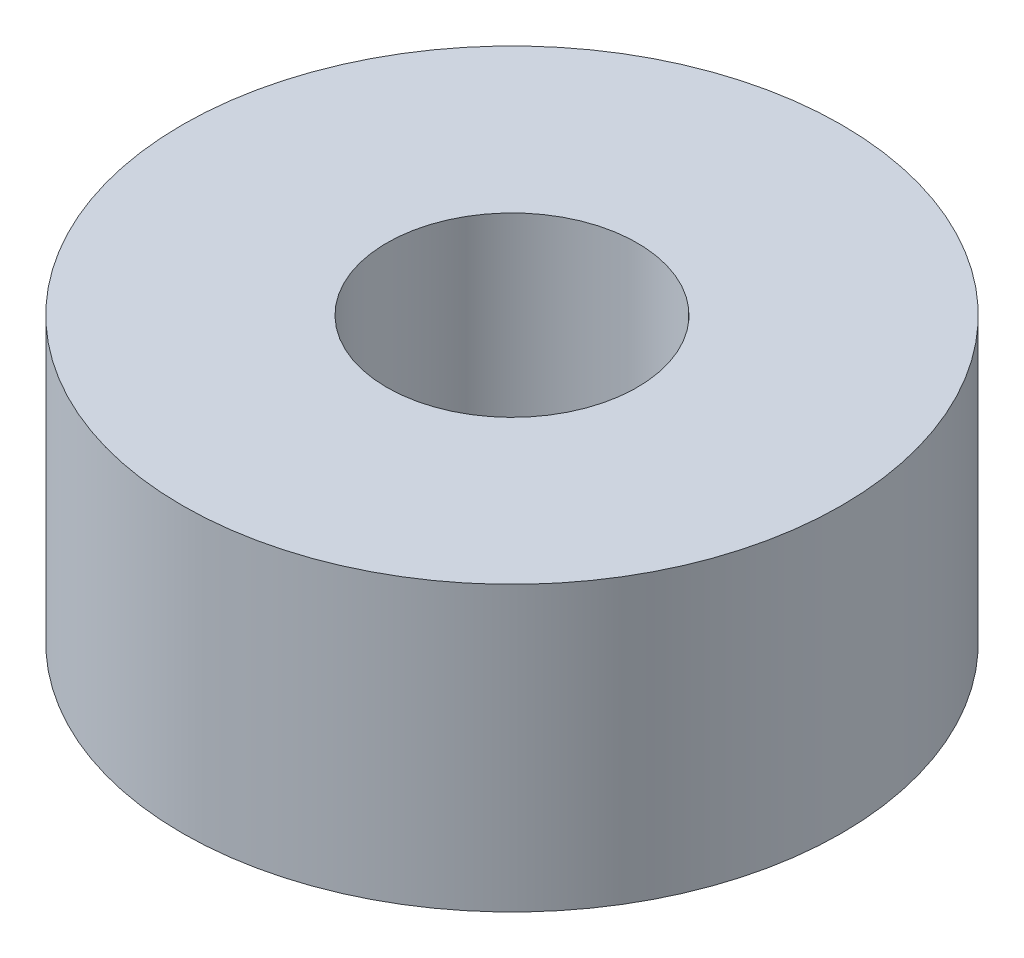
ISO-10303-21;
HEADER;
FILE_DESCRIPTION(('STEP AP214'),'2;1');
FILE_NAME('part.step','',(''),(''),'','','');
FILE_SCHEMA(('AUTOMOTIVE_DESIGN { 1 0 10303 214 1 1 1 1 }'));
ENDSEC;
DATA;
#1=APPLICATION_CONTEXT('core data for automotive mechanical design processes');
#2=APPLICATION_PROTOCOL_DEFINITION('international standard','automotive_design',2000,#1);
#3=PRODUCT_CONTEXT('',#1,'mechanical');
#4=PRODUCT('Part','Part','',(#3));
#5=PRODUCT_RELATED_PRODUCT_CATEGORY('part','',(#4));
#6=PRODUCT_DEFINITION_FORMATION('','',#4);
#7=PRODUCT_DEFINITION_CONTEXT('part definition',#1,'design');
#8=PRODUCT_DEFINITION('design','',#6,#7);
#9=PRODUCT_DEFINITION_SHAPE('','',#8);
#10=(LENGTH_UNIT() NAMED_UNIT(*) SI_UNIT(.MILLI.,.METRE.));
#11=(NAMED_UNIT(*) PLANE_ANGLE_UNIT() SI_UNIT($,.RADIAN.));
#12=(NAMED_UNIT(*) SI_UNIT($,.STERADIAN.) SOLID_ANGLE_UNIT());
#13=UNCERTAINTY_MEASURE_WITH_UNIT(LENGTH_MEASURE(1.E-05),#10,'distance_accuracy_value','');
#14=(GEOMETRIC_REPRESENTATION_CONTEXT(3) GLOBAL_UNCERTAINTY_ASSIGNED_CONTEXT((#13)) GLOBAL_UNIT_ASSIGNED_CONTEXT((#10,
#11,#12)) REPRESENTATION_CONTEXT('',''));
#15=CARTESIAN_POINT('',(0.,0.,0.));
#16=DIRECTION('',(0.,0.,1.));
#17=DIRECTION('',(1.,0.,0.));
#18=AXIS2_PLACEMENT_3D('',#15,#16,#17);
#19=CARTESIAN_POINT('',(0.,3.4,0.));
#20=DIRECTION('',(0.,1.,0.));
#21=DIRECTION('',(0.,0.,1.));
#22=AXIS2_PLACEMENT_3D('',#19,#20,#21);
#23=PLANE('',#22);
#24=CARTESIAN_POINT('',(0.,3.4,0.));
#25=DIRECTION('',(0.,1.,0.));
#26=DIRECTION('',(0.,0.,1.));
#27=AXIS2_PLACEMENT_3D('',#24,#25,#26);
#28=CIRCLE('',#27,3.95);
#29=CARTESIAN_POINT('',(0.,3.4,3.95));
#30=VERTEX_POINT('',#29);
#31=EDGE_CURVE('E10',#30,#30,#28,.T.);
#32=ORIENTED_EDGE('',*,*,#31,.T.);
#33=EDGE_LOOP('',(#32));
#34=FACE_BOUND('',#33,.T.);
#35=CARTESIAN_POINT('',(0.,3.4,0.));
#36=DIRECTION('',(0.,1.,0.));
#37=DIRECTION('',(0.,0.,1.));
#38=AXIS2_PLACEMENT_3D('',#35,#36,#37);
#39=CIRCLE('',#38,1.5);
#40=CARTESIAN_POINT('',(0.,3.4,1.5));
#41=VERTEX_POINT('',#40);
#42=EDGE_CURVE('E45',#41,#41,#39,.T.);
#43=ORIENTED_EDGE('',*,*,#42,.F.);
#44=EDGE_LOOP('',(#43));
#45=FACE_BOUND('',#44,.T.);
#46=ADVANCED_FACE('F34',(#34,#45),#23,.T.);
#47=CARTESIAN_POINT('',(0.,0.,0.));
#48=DIRECTION('',(0.,1.,0.));
#49=DIRECTION('',(0.,0.,1.));
#50=AXIS2_PLACEMENT_3D('',#47,#48,#49);
#51=PLANE('',#50);
#52=CARTESIAN_POINT('',(0.,0.,0.));
#53=DIRECTION('',(0.,1.,0.));
#54=DIRECTION('',(0.,0.,1.));
#55=AXIS2_PLACEMENT_3D('',#52,#53,#54);
#56=CIRCLE('',#55,3.95);
#57=CARTESIAN_POINT('',(0.,0.,3.95));
#58=VERTEX_POINT('',#57);
#59=EDGE_CURVE('E38',#58,#58,#56,.T.);
#60=ORIENTED_EDGE('',*,*,#59,.F.);
#61=EDGE_LOOP('',(#60));
#62=FACE_BOUND('',#61,.T.);
#63=CARTESIAN_POINT('',(0.,0.,0.));
#64=DIRECTION('',(0.,1.,0.));
#65=DIRECTION('',(0.,0.,1.));
#66=AXIS2_PLACEMENT_3D('',#63,#64,#65);
#67=CIRCLE('',#66,1.5);
#68=CARTESIAN_POINT('',(0.,0.,1.5));
#69=VERTEX_POINT('',#68);
#70=EDGE_CURVE('E47',#69,#69,#67,.T.);
#71=ORIENTED_EDGE('',*,*,#70,.T.);
#72=EDGE_LOOP('',(#71));
#73=FACE_BOUND('',#72,.T.);
#74=ADVANCED_FACE('F57',(#62,#73),#51,.F.);
#75=CARTESIAN_POINT('',(0.,3.4,0.));
#76=DIRECTION('',(0.,-1.,0.));
#77=DIRECTION('',(0.,0.,-1.));
#78=AXIS2_PLACEMENT_3D('',#75,#76,#77);
#79=CYLINDRICAL_SURFACE('',#78,3.95);
#80=ORIENTED_EDGE('',*,*,#31,.F.);
#81=EDGE_LOOP('',(#80));
#82=FACE_BOUND('',#81,.T.);
#83=ORIENTED_EDGE('',*,*,#59,.T.);
#84=EDGE_LOOP('',(#83));
#85=FACE_BOUND('',#84,.T.);
#86=ADVANCED_FACE('F36',(#82,#85),#79,.T.);
#87=CARTESIAN_POINT('',(0.,3.4,0.));
#88=DIRECTION('',(0.,-1.,0.));
#89=DIRECTION('',(0.,0.,-1.));
#90=AXIS2_PLACEMENT_3D('',#87,#88,#89);
#91=CYLINDRICAL_SURFACE('',#90,1.5);
#92=ORIENTED_EDGE('',*,*,#42,.T.);
#93=EDGE_LOOP('',(#92));
#94=FACE_BOUND('',#93,.T.);
#95=ORIENTED_EDGE('',*,*,#70,.F.);
#96=EDGE_LOOP('',(#95));
#97=FACE_BOUND('',#96,.T.);
#98=ADVANCED_FACE('F53',(#94,#97),#91,.F.);
#99=CLOSED_SHELL('',(#46,#74,#86,#98));
#100=MANIFOLD_SOLID_BREP('B2',#99);
#101=ADVANCED_BREP_SHAPE_REPRESENTATION('',(#18,#100),#14);
#102=SHAPE_DEFINITION_REPRESENTATION(#9,#101);
ENDSEC;
END-ISO-10303-21;
